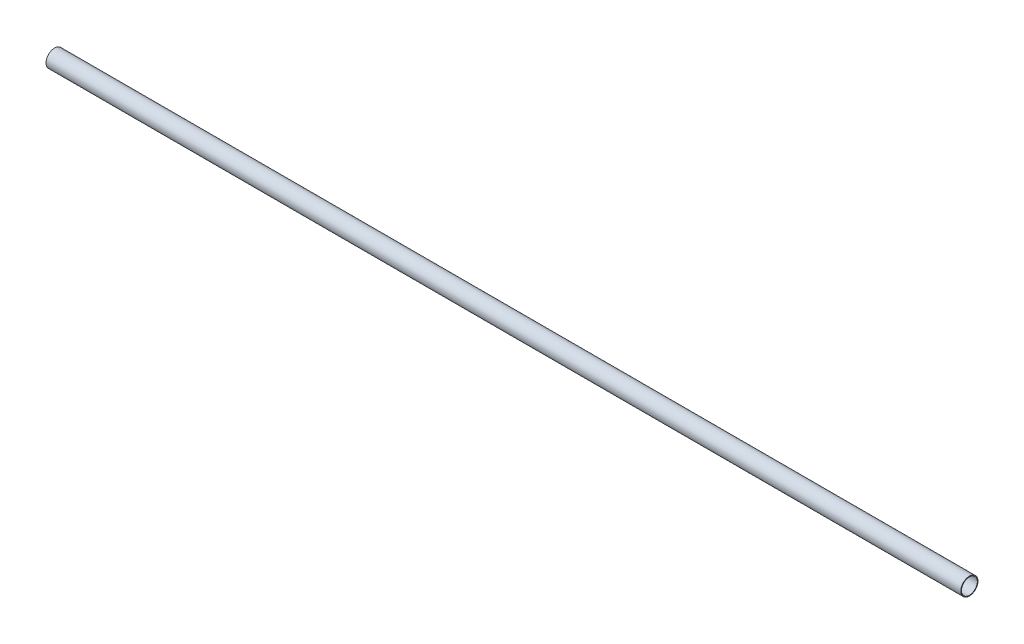
ISO-10303-21;
HEADER;
FILE_DESCRIPTION(('STEP AP214'),'2;1');
FILE_NAME('part.step','',(''),(''),'','','');
FILE_SCHEMA(('AUTOMOTIVE_DESIGN { 1 0 10303 214 1 1 1 1 }'));
ENDSEC;
DATA;
#1=APPLICATION_CONTEXT('core data for automotive mechanical design processes');
#2=APPLICATION_PROTOCOL_DEFINITION('international standard','automotive_design',2000,#1);
#3=PRODUCT_CONTEXT('',#1,'mechanical');
#4=PRODUCT('Part','Part','',(#3));
#5=PRODUCT_RELATED_PRODUCT_CATEGORY('part','',(#4));
#6=PRODUCT_DEFINITION_FORMATION('','',#4);
#7=PRODUCT_DEFINITION_CONTEXT('part definition',#1,'design');
#8=PRODUCT_DEFINITION('design','',#6,#7);
#9=PRODUCT_DEFINITION_SHAPE('','',#8);
#10=(LENGTH_UNIT() NAMED_UNIT(*) SI_UNIT(.MILLI.,.METRE.));
#11=(NAMED_UNIT(*) PLANE_ANGLE_UNIT() SI_UNIT($,.RADIAN.));
#12=(NAMED_UNIT(*) SI_UNIT($,.STERADIAN.) SOLID_ANGLE_UNIT());
#13=UNCERTAINTY_MEASURE_WITH_UNIT(LENGTH_MEASURE(1.E-05),#10,'distance_accuracy_value','');
#14=(GEOMETRIC_REPRESENTATION_CONTEXT(3) GLOBAL_UNCERTAINTY_ASSIGNED_CONTEXT((#13)) GLOBAL_UNIT_ASSIGNED_CONTEXT((#10,
#11,#12)) REPRESENTATION_CONTEXT('',''));
#15=CARTESIAN_POINT('',(0.,0.,0.));
#16=DIRECTION('',(0.,0.,1.));
#17=DIRECTION('',(1.,0.,0.));
#18=AXIS2_PLACEMENT_3D('',#15,#16,#17);
#19=CARTESIAN_POINT('',(1350.,0.,0.));
#20=DIRECTION('',(1.,0.,0.));
#21=DIRECTION('',(0.,0.,-1.));
#22=AXIS2_PLACEMENT_3D('',#19,#20,#21);
#23=PLANE('',#22);
#24=CARTESIAN_POINT('',(1350.,0.,0.));
#25=DIRECTION('',(1.,0.,0.));
#26=DIRECTION('',(0.,0.,-1.));
#27=AXIS2_PLACEMENT_3D('',#24,#25,#26);
#28=CIRCLE('',#27,25.4);
#29=CARTESIAN_POINT('',(1350.,0.,-25.4));
#30=VERTEX_POINT('',#29);
#31=EDGE_CURVE('E111',#30,#30,#28,.T.);
#32=ORIENTED_EDGE('',*,*,#31,.T.);
#33=EDGE_LOOP('',(#32));
#34=FACE_BOUND('',#33,.T.);
#35=CARTESIAN_POINT('',(1350.,0.,0.));
#36=DIRECTION('',(1.,0.,0.));
#37=DIRECTION('',(0.,0.,-1.));
#38=AXIS2_PLACEMENT_3D('',#35,#36,#37);
#39=CIRCLE('',#38,23.4);
#40=CARTESIAN_POINT('',(1350.,0.,-23.4));
#41=VERTEX_POINT('',#40);
#42=EDGE_CURVE('E105',#41,#41,#39,.T.);
#43=ORIENTED_EDGE('',*,*,#42,.F.);
#44=EDGE_LOOP('',(#43));
#45=FACE_BOUND('',#44,.T.);
#46=ADVANCED_FACE('F32',(#34,#45),#23,.T.);
#47=CARTESIAN_POINT('',(-1350.,0.,0.));
#48=DIRECTION('',(1.,0.,0.));
#49=DIRECTION('',(0.,0.,-1.));
#50=AXIS2_PLACEMENT_3D('',#47,#48,#49);
#51=PLANE('',#50);
#52=CARTESIAN_POINT('',(-1350.,0.,0.));
#53=DIRECTION('',(1.,0.,0.));
#54=DIRECTION('',(0.,0.,-1.));
#55=AXIS2_PLACEMENT_3D('',#52,#53,#54);
#56=CIRCLE('',#55,25.4);
#57=CARTESIAN_POINT('',(-1350.,0.,-25.4));
#58=VERTEX_POINT('',#57);
#59=EDGE_CURVE('E108',#58,#58,#56,.T.);
#60=ORIENTED_EDGE('',*,*,#59,.F.);
#61=EDGE_LOOP('',(#60));
#62=FACE_BOUND('',#61,.T.);
#63=CARTESIAN_POINT('',(-1350.,0.,0.));
#64=DIRECTION('',(1.,0.,0.));
#65=DIRECTION('',(0.,0.,-1.));
#66=AXIS2_PLACEMENT_3D('',#63,#64,#65);
#67=CIRCLE('',#66,23.4);
#68=CARTESIAN_POINT('',(-1350.,0.,-23.4));
#69=VERTEX_POINT('',#68);
#70=EDGE_CURVE('E86',#69,#69,#67,.T.);
#71=ORIENTED_EDGE('',*,*,#70,.T.);
#72=EDGE_LOOP('',(#71));
#73=FACE_BOUND('',#72,.T.);
#74=ADVANCED_FACE('F152',(#62,#73),#51,.F.);
#75=CARTESIAN_POINT('',(1350.,0.,0.));
#76=DIRECTION('',(-1.,0.,0.));
#77=DIRECTION('',(0.,0.,1.));
#78=AXIS2_PLACEMENT_3D('',#75,#76,#77);
#79=CYLINDRICAL_SURFACE('',#78,25.4);
#80=CARTESIAN_POINT('',(-1335.46577712364,0.,-25.4));
#81=CARTESIAN_POINT('',(-1335.46578622155,0.22320132829687,-25.3999963048456));
#82=CARTESIAN_POINT('',(-1335.48452227427,0.446528817383909,-25.3970271916482));
#83=CARTESIAN_POINT('',(-1335.55894716432,0.886932163470755,-25.3854686317683));
#84=CARTESIAN_POINT('',(-1335.61467111013,1.10400187620866,-25.376873845372));
#85=CARTESIAN_POINT('',(-1335.76135760594,1.52545320040674,-25.3550289969891));
#86=CARTESIAN_POINT('',(-1335.85229256232,1.72984460225414,-25.3417825810753));
#87=CARTESIAN_POINT('',(-1336.06675019398,2.12043884011586,-25.3120950335819));
#88=CARTESIAN_POINT('',(-1336.19026869338,2.3066440026761,-25.295654311453));
#89=CARTESIAN_POINT('',(-1336.46751502863,2.6572059411343,-25.2612462689999));
#90=CARTESIAN_POINT('',(-1336.62146736231,2.82138413445844,-25.2432682042159));
#91=CARTESIAN_POINT('',(-1336.95472804527,3.12169012879659,-25.2078949969187));
#92=CARTESIAN_POINT('',(-1337.1340379124,3.25781624947959,-25.1904998893771));
#93=CARTESIAN_POINT('',(-1337.51413547559,3.49885821732156,-25.1581579992775));
#94=CARTESIAN_POINT('',(-1337.71503509387,3.60359960030141,-25.1432251029844));
#95=CARTESIAN_POINT('',(-1338.13185033653,3.77778362313468,-25.1176461765073));
#96=CARTESIAN_POINT('',(-1338.34776505674,3.847228386359,-25.1069998884578));
#97=CARTESIAN_POINT('',(-1338.78659663129,3.94828970932429,-25.0913058334978));
#98=CARTESIAN_POINT('',(-1339.00944115593,3.98021316108151,-25.0862126720068));
#99=CARTESIAN_POINT('',(-1339.45737769604,4.0062767445737,-25.0820639489634));
#100=CARTESIAN_POINT('',(-1339.68246956852,4.00041926496776,-25.0830080057142));
#101=CARTESIAN_POINT('',(-1340.12633342745,3.95133769468823,-25.0907855692924));
#102=CARTESIAN_POINT('',(-1340.3451444359,3.90845668628441,-25.0975650002669));
#103=CARTESIAN_POINT('',(-1340.77242669155,3.78708294390799,-25.1161648938635));
#104=CARTESIAN_POINT('',(-1340.9808976188,3.70858910870606,-25.1279855123701));
#105=CARTESIAN_POINT('',(-1341.38261851354,3.51786497065764,-25.1553950542063));
#106=CARTESIAN_POINT('',(-1341.575798941,3.4054905952611,-25.1710000133761));
#107=CARTESIAN_POINT('',(-1341.94069143724,3.15029773841544,-25.204208565353));
#108=CARTESIAN_POINT('',(-1342.11240195404,3.00747705815027,-25.2218123024679));
#109=CARTESIAN_POINT('',(-1342.4314677136,2.69356859729772,-25.2572732692388));
#110=CARTESIAN_POINT('',(-1342.57853309469,2.52218610955714,-25.2751311516354));
#111=CARTESIAN_POINT('',(-1342.84186003575,2.15702001416614,-25.3089081302338));
#112=CARTESIAN_POINT('',(-1342.95812143469,1.96323628941501,-25.3248272162998));
#113=CARTESIAN_POINT('',(-1343.1565600706,1.55850799610384,-25.3529521069687));
#114=CARTESIAN_POINT('',(-1343.23871353002,1.3475515781293,-25.3651553195624));
#115=CARTESIAN_POINT('',(-1343.36634485434,0.914600993953395,-25.3844522233017));
#116=CARTESIAN_POINT('',(-1343.41182545486,0.692607652363941,-25.3915462955598));
#117=CARTESIAN_POINT('',(-1343.46443132465,0.246385030525779,-25.3997747978797));
#118=CARTESIAN_POINT('',(-1343.47195483973,0.0222038000204775,-25.4009711042602));
#119=CARTESIAN_POINT('',(-1343.44949207929,-0.424217598490147,-25.3974381710905));
#120=CARTESIAN_POINT('',(-1343.41950708751,-0.646457832663801,-25.3927091343346));
#121=CARTESIAN_POINT('',(-1343.32320968329,-1.08147196818116,-25.3778951520576));
#122=CARTESIAN_POINT('',(-1343.25709266548,-1.29429018904899,-25.3678390232502));
#123=CARTESIAN_POINT('',(-1343.0906150597,-1.70582107435153,-25.3434943492887));
#124=CARTESIAN_POINT('',(-1342.99025272351,-1.90453301804432,-25.3292055880664));
#125=CARTESIAN_POINT('',(-1342.75720878978,-2.28395253972232,-25.2978286107273));
#126=CARTESIAN_POINT('',(-1342.62427624932,-2.46450418419877,-25.2807190129001));
#127=CARTESIAN_POINT('',(-1342.33021291834,-2.80087851277391,-25.2456676091585));
#128=CARTESIAN_POINT('',(-1342.16908031162,-2.9566996028881,-25.2277257496978));
#129=CARTESIAN_POINT('',(-1341.82141203782,-3.24065058894714,-25.1928340779654));
#130=CARTESIAN_POINT('',(-1341.63465633801,-3.36851258781255,-25.1758949089374));
#131=CARTESIAN_POINT('',(-1341.24208361991,-3.59104987751306,-25.145119492013));
#132=CARTESIAN_POINT('',(-1341.03626715716,-3.68572613518738,-25.1312831537224));
#133=CARTESIAN_POINT('',(-1340.61219238071,-3.83879553844053,-25.1083582995216));
#134=CARTESIAN_POINT('',(-1340.39398476485,-3.89732632664429,-25.0992517936559));
#135=CARTESIAN_POINT('',(-1339.95068139388,-3.97687933024703,-25.0867710154198));
#136=CARTESIAN_POINT('',(-1339.72558616904,-3.99790442580794,-25.0833963028907));
#137=CARTESIAN_POINT('',(-1339.27756948476,-4.0017755295102,-25.0827787630464));
#138=CARTESIAN_POINT('',(-1339.05465164642,-3.98504294753408,-25.0854682534716));
#139=CARTESIAN_POINT('',(-1338.61484367466,-3.91478029522453,-25.0965284468486));
#140=CARTESIAN_POINT('',(-1338.39795352747,-3.86125030890797,-25.1048991368289));
#141=CARTESIAN_POINT('',(-1337.97649463766,-3.71906686894459,-25.1263539986715));
#142=CARTESIAN_POINT('',(-1337.77191471338,-3.63044586145514,-25.1394338153301));
#143=CARTESIAN_POINT('',(-1337.38045843797,-3.42063846967856,-25.1688379679289));
#144=CARTESIAN_POINT('',(-1337.19358280936,-3.29945075711808,-25.1851624361991));
#145=CARTESIAN_POINT('',(-1336.84070390847,-3.02643070576745,-25.2194328374939));
#146=CARTESIAN_POINT('',(-1336.67494289661,-2.87428713240574,-25.2373941246537));
#147=CARTESIAN_POINT('',(-1336.37115725493,-2.5443317033794,-25.2727887089707));
#148=CARTESIAN_POINT('',(-1336.23313905835,-2.36651391053583,-25.2902218828701));
#149=CARTESIAN_POINT('',(-1335.98799598179,-1.98897413334483,-25.3227184076354));
#150=CARTESIAN_POINT('',(-1335.88106484242,-1.78912505569151,-25.3377666415464));
#151=CARTESIAN_POINT('',(-1335.70245112027,-1.37415386484051,-25.3636501714065));
#152=CARTESIAN_POINT('',(-1335.63073263936,-1.15904756306151,-25.3744897555636));
#153=CARTESIAN_POINT('',(-1335.54054462394,-0.785859429064369,-25.3883076356595));
#154=CARTESIAN_POINT('',(-1335.51255054884,-0.630061832277178,-25.3926693557502));
#155=CARTESIAN_POINT('',(-1335.47516370994,-0.316197242810094,-25.398516826142));
#156=CARTESIAN_POINT('',(-1335.46577067808,-0.158130282866009,-25.4000026178868));
#157=CARTESIAN_POINT('',(-1335.46577712364,0.,-25.4));
#158=B_SPLINE_CURVE_WITH_KNOTS('',3,(#80,#81,#82,#83,#84,#85,#86,#87,#88,#89,#90,#91,#92,#93,
#94,#95,#96,#97,#98,#99,#100,#101,#102,#103,#104,#105,#106,#107,#108,#109,#110,#111,#112,#113,
#114,#115,#116,#117,#118,#119,#120,#121,#122,#123,#124,#125,#126,#127,#128,#129,#130,#131,#132,
#133,#134,#135,#136,#137,#138,#139,#140,#141,#142,#143,#144,#145,#146,#147,#148,#149,#150,#151,
#152,#153,#154,#155,#156,#157),.UNSPECIFIED.,.T.,.F.,(4,2,2,2,2,2,2,2,2,2,2,2,2,2,2,2,2,2,2,2,2,
2,2,2,2,2,2,2,2,2,2,2,2,2,2,2,2,2,4),(0.,0.669026079209023,1.33868809980632,2.00782638855552,
2.67687896273317,3.35106455681452,4.02529052316656,4.7031977209859,5.38106413249618,
6.05334672177282,6.72558680711622,7.39166356492719,8.05776092074523,8.72673170461458,
9.39575081757729,10.0721571157612,10.7485669499654,11.4254475389495,12.102277631303,
12.7719914331612,13.4416823147384,14.1077869753407,14.7739256452369,15.4453676616824,
16.1168529377283,16.794514766337,17.4721568501855,18.1472022860515,18.8221958811504,
19.4896932436495,20.1571890821049,20.8240691707268,21.4909764630074,22.1649534045539,
22.8390864540498,23.517334937826,24.1948905268534,24.6688787800976,25.1428602028665),.UNSPECIFIED.);
#159=CARTESIAN_POINT('',(-1335.46577712364,0.,-25.4));
#160=VERTEX_POINT('',#159);
#161=EDGE_CURVE('E95',#160,#160,#158,.T.);
#162=ORIENTED_EDGE('',*,*,#161,.T.);
#163=EDGE_LOOP('',(#162));
#164=FACE_BOUND('',#163,.T.);
#165=DIRECTION('',(-1.,0.,0.));
#166=VECTOR('',#165,1.);
#167=CARTESIAN_POINT('',(1350.,5.00000000000012,-24.9030118660374));
#168=LINE('',#167,#166);
#169=CARTESIAN_POINT('',(1260.,5.00000000000011,-24.9030118660374));
#170=VERTEX_POINT('',#169);
#171=CARTESIAN_POINT('',(-1260.,4.9999999999998,-24.9030118660374));
#172=VERTEX_POINT('',#171);
#173=EDGE_CURVE('E82',#170,#172,#168,.T.);
#174=ORIENTED_EDGE('',*,*,#173,.T.);
#175=CARTESIAN_POINT('',(-1260.,0.,0.));
#176=DIRECTION('',(-1.,0.,0.));
#177=DIRECTION('',(0.,0.,1.));
#178=AXIS2_PLACEMENT_3D('',#175,#176,#177);
#179=CIRCLE('',#178,25.4);
#180=CARTESIAN_POINT('',(-1260.,-5.0000000000002,-24.9030118660374));
#181=VERTEX_POINT('',#180);
#182=EDGE_CURVE('E78',#172,#181,#179,.T.);
#183=ORIENTED_EDGE('',*,*,#182,.T.);
#184=DIRECTION('',(-1.,0.,0.));
#185=VECTOR('',#184,1.);
#186=CARTESIAN_POINT('',(1350.,-4.99999999999988,-24.9030118660374));
#187=LINE('',#186,#185);
#188=CARTESIAN_POINT('',(1260.,-4.99999999999989,-24.9030118660374));
#189=VERTEX_POINT('',#188);
#190=EDGE_CURVE('E80',#181,#189,#187,.F.);
#191=ORIENTED_EDGE('',*,*,#190,.T.);
#192=CARTESIAN_POINT('',(1260.,0.,0.));
#193=DIRECTION('',(1.,0.,0.));
#194=DIRECTION('',(0.,0.,-1.));
#195=AXIS2_PLACEMENT_3D('',#192,#193,#194);
#196=CIRCLE('',#195,25.4);
#197=EDGE_CURVE('E89',#189,#170,#196,.T.);
#198=ORIENTED_EDGE('',*,*,#197,.T.);
#199=EDGE_LOOP('',(#174,#183,#191,#198));
#200=FACE_BOUND('',#199,.T.);
#201=ORIENTED_EDGE('',*,*,#31,.F.);
#202=EDGE_LOOP('',(#201));
#203=FACE_BOUND('',#202,.T.);
#204=ORIENTED_EDGE('',*,*,#59,.T.);
#205=EDGE_LOOP('',(#204));
#206=FACE_BOUND('',#205,.T.);
#207=ADVANCED_FACE('F34',(#164,#200,#203,#206),#79,.T.);
#208=CARTESIAN_POINT('',(1350.,0.,0.));
#209=DIRECTION('',(-1.,0.,0.));
#210=DIRECTION('',(0.,0.,1.));
#211=AXIS2_PLACEMENT_3D('',#208,#209,#210);
#212=CYLINDRICAL_SURFACE('',#211,23.4);
#213=CARTESIAN_POINT('',(-1335.46577712364,0.,-23.4));
#214=CARTESIAN_POINT('',(-1335.46578598634,0.222940372110689,-23.3999961265631));
#215=CARTESIAN_POINT('',(-1335.48447849491,0.446000302550702,-23.3967808179266));
#216=CARTESIAN_POINT('',(-1335.55872022176,0.885858229001332,-23.3842639873838));
#217=CARTESIAN_POINT('',(-1335.6143027867,1.10265037406509,-23.3749569589891));
#218=CARTESIAN_POINT('',(-1335.7605925434,1.52354574677073,-23.351300048625));
#219=CARTESIAN_POINT('',(-1335.85127041278,1.72765940259511,-23.3369543773985));
#220=CARTESIAN_POINT('',(-1336.06509868528,2.11775050016078,-23.3047954039874));
#221=CARTESIAN_POINT('',(-1336.18824558918,2.30372989329347,-23.2869824755267));
#222=CARTESIAN_POINT('',(-1336.46483025906,2.65416410727059,-23.2496621222938));
#223=CARTESIAN_POINT('',(-1336.61853019847,2.81841055845502,-23.2301409128786));
#224=CARTESIAN_POINT('',(-1336.95129370134,3.11891608589203,-23.1917090326056));
#225=CARTESIAN_POINT('',(-1337.13035890599,3.25517334977036,-23.1727984013513));
#226=CARTESIAN_POINT('',(-1337.51020945569,3.49667396504465,-23.1375952395481));
#227=CARTESIAN_POINT('',(-1337.71112833871,3.60171010003428,-23.1213205141938));
#228=CARTESIAN_POINT('',(-1338.12808309019,3.77646148207153,-23.0934237150091));
#229=CARTESIAN_POINT('',(-1338.34411788165,3.84617924261551,-23.0818013101001));
#230=CARTESIAN_POINT('',(-1338.78295901979,3.94765590481854,-23.0646626218229));
#231=CARTESIAN_POINT('',(-1339.00567970476,3.97977528117881,-23.059088390019));
#232=CARTESIAN_POINT('',(-1339.45341359249,4.00626132353227,-23.0545020090251));
#233=CARTESIAN_POINT('',(-1339.67842662334,4.00063080001318,-23.0554893713229));
#234=CARTESIAN_POINT('',(-1340.12177719994,3.95207023068563,-23.0638617396133));
#235=CARTESIAN_POINT('',(-1340.34016071154,3.9095460900212,-23.0711771218823));
#236=CARTESIAN_POINT('',(-1340.76664722086,3.78904283300528,-23.0912722138768));
#237=CARTESIAN_POINT('',(-1340.97474984901,3.71106244318086,-23.1040521198692));
#238=CARTESIAN_POINT('',(-1341.37597707579,3.52145160666646,-23.1337110210633));
#239=CARTESIAN_POINT('',(-1341.56902088747,3.40965352231409,-23.1506103537268));
#240=CARTESIAN_POINT('',(-1341.93376254385,3.15569976204398,-23.1865899962551));
#241=CARTESIAN_POINT('',(-1342.10545857641,3.01354151174386,-23.2056704910071));
#242=CARTESIAN_POINT('',(-1342.42497958831,2.70069572069545,-23.2441679965478));
#243=CARTESIAN_POINT('',(-1342.57246385916,2.52966012551652,-23.2635861496938));
#244=CARTESIAN_POINT('',(-1342.83669232938,2.16508939820843,-23.3003411645487));
#245=CARTESIAN_POINT('',(-1342.95343631112,1.9715541068053,-23.3176780115225));
#246=CARTESIAN_POINT('',(-1343.15290500451,1.56715053683592,-23.3483435607896));
#247=CARTESIAN_POINT('',(-1343.2355985743,1.35626660204703,-23.3616685909726));
#248=CARTESIAN_POINT('',(-1343.36429737591,0.923324486033739,-23.382779897454));
#249=CARTESIAN_POINT('',(-1343.41030583838,0.701267290607831,-23.3905666614702));
#250=CARTESIAN_POINT('',(-1343.46386412471,0.25521757300059,-23.3996582201952));
#251=CARTESIAN_POINT('',(-1343.47188149204,0.0312827406514265,-23.4010418115882));
#252=CARTESIAN_POINT('',(-1343.45047799131,-0.414729841766611,-23.3973873107757));
#253=CARTESIAN_POINT('',(-1343.42105864128,-0.636807666767839,-23.3923494789529));
#254=CARTESIAN_POINT('',(-1343.32600567477,-1.07135049441291,-23.376467025083));
#255=CARTESIAN_POINT('',(-1343.2606045323,-1.28386782982784,-23.3656596922424));
#256=CARTESIAN_POINT('',(-1343.09569303719,-1.69492162228745,-23.3394450974249));
#257=CARTESIAN_POINT('',(-1342.99618068738,-1.89345725989892,-23.3240375661184));
#258=CARTESIAN_POINT('',(-1342.76480782417,-2.27293588462409,-23.2901359447006));
#259=CARTESIAN_POINT('',(-1342.63265650125,-2.45369908034729,-23.2716146127203));
#260=CARTESIAN_POINT('',(-1342.34015572962,-2.79065044811609,-23.2336194803354));
#261=CARTESIAN_POINT('',(-1342.17980411941,-2.94683673464546,-23.2141456070028));
#262=CARTESIAN_POINT('',(-1341.83335363922,-3.23194239691053,-23.1761841188708));
#263=CARTESIAN_POINT('',(-1341.64699261548,-3.36054523466335,-23.1577096035047));
#264=CARTESIAN_POINT('',(-1341.25503791413,-3.58461985277518,-23.1240868391052));
#265=CARTESIAN_POINT('',(-1341.04944486898,-3.68009272213401,-23.1089384807452));
#266=CARTESIAN_POINT('',(-1340.62573122262,-3.8347286439771,-23.083782369853));
#267=CARTESIAN_POINT('',(-1340.40766858866,-3.89404680129622,-23.0737526886301));
#268=CARTESIAN_POINT('',(-1339.96448811462,-3.97517581377871,-23.0599154460745));
#269=CARTESIAN_POINT('',(-1339.73937092497,-3.99699011647669,-23.0561073128288));
#270=CARTESIAN_POINT('',(-1339.29163425403,-4.00239224250222,-23.0551698550697));
#271=CARTESIAN_POINT('',(-1339.06902081269,-3.986478498361,-23.0579534454608));
#272=CARTESIAN_POINT('',(-1338.62968933473,-3.91795667598788,-23.0696944967354));
#273=CARTESIAN_POINT('',(-1338.41297127608,-3.86534873484488,-23.0786519345535));
#274=CARTESIAN_POINT('',(-1337.99178995687,-3.7251266868852,-23.1016975984051));
#275=CARTESIAN_POINT('',(-1337.78731129868,-3.63755767410798,-23.1157792130288));
#276=CARTESIAN_POINT('',(-1337.39586720842,-3.42995103203085,-23.1474926205498));
#277=CARTESIAN_POINT('',(-1337.20890271934,-3.30991165584959,-23.1651246044415));
#278=CARTESIAN_POINT('',(-1336.8552800939,-3.03900186894387,-23.2022270412092));
#279=CARTESIAN_POINT('',(-1336.68890438562,-2.88776551129381,-23.2217176855487));
#280=CARTESIAN_POINT('',(-1336.38372285541,-2.55952503872298,-23.2601822932373));
#281=CARTESIAN_POINT('',(-1336.24492339608,-2.38251499340386,-23.2791561364771));
#282=CARTESIAN_POINT('',(-1335.99790336449,-2.0062123227739,-23.3146103346149));
#283=CARTESIAN_POINT('',(-1335.88991353087,-1.8067663973359,-23.3310714660638));
#284=CARTESIAN_POINT('',(-1335.70913876925,-1.3923608817256,-23.3594584624716));
#285=CARTESIAN_POINT('',(-1335.63631916647,-1.1774168127121,-23.371388791914));
#286=CARTESIAN_POINT('',(-1335.54355939042,-0.801396199646937,-23.3867997268503));
#287=CARTESIAN_POINT('',(-1335.51443835765,-0.642580379476468,-23.3917230810422));
#288=CARTESIAN_POINT('',(-1335.47554419888,-0.322530536874817,-23.3983245885204));
#289=CARTESIAN_POINT('',(-1335.4657707115,-0.161296559665428,-23.4000028024177));
#290=CARTESIAN_POINT('',(-1335.46577712364,0.,-23.4));
#291=B_SPLINE_CURVE_WITH_KNOTS('',3,(#213,#214,#215,#216,#217,#218,#219,#220,#221,#222,#223,
#224,#225,#226,#227,#228,#229,#230,#231,#232,#233,#234,#235,#236,#237,#238,#239,#240,#241,#242,
#243,#244,#245,#246,#247,#248,#249,#250,#251,#252,#253,#254,#255,#256,#257,#258,#259,#260,#261,
#262,#263,#264,#265,#266,#267,#268,#269,#270,#271,#272,#273,#274,#275,#276,#277,#278,#279,#280,
#281,#282,#283,#284,#285,#286,#287,#288,#289,#290),.UNSPECIFIED.,.T.,.F.,(4,2,2,2,2,2,2,2,2,2,2,
2,2,2,2,2,2,2,2,2,2,2,2,2,2,2,2,2,2,2,2,2,2,2,2,2,2,2,4),(0.,0.668231475792542,1.33706782182497,
2.0053465527747,2.67355329205341,3.34776271929399,4.02201578963388,4.70064881295013,
5.37923353332572,6.05125760416755,6.72323164323632,7.38790502265663,8.05260227686507,
8.72065005429519,9.3887545011699,10.0655765561423,10.7424034025883,11.4198478941979,
12.0972327204351,12.7662591653276,13.4352584826946,14.0999853885291,14.7647512200216,
15.4356683913679,16.1066370097491,16.7849360755555,17.4632128431953,18.1385589165734,
18.8138429055737,19.480255401847,20.1466654084279,20.8122186183001,21.4778076415629,
22.1517001502576,22.8257479640478,23.5047187276887,24.1830187121726,24.6664908184866,
25.1499538946672),.UNSPECIFIED.);
#292=CARTESIAN_POINT('',(-1335.46577712364,0.,-23.4));
#293=VERTEX_POINT('',#292);
#294=EDGE_CURVE('E37',#293,#293,#291,.T.);
#295=ORIENTED_EDGE('',*,*,#294,.F.);
#296=EDGE_LOOP('',(#295));
#297=FACE_BOUND('',#296,.T.);
#298=CARTESIAN_POINT('',(-1260.,0.,0.));
#299=DIRECTION('',(-1.,0.,0.));
#300=DIRECTION('',(0.,0.,1.));
#301=AXIS2_PLACEMENT_3D('',#298,#299,#300);
#302=CIRCLE('',#301,23.4);
#303=CARTESIAN_POINT('',(-1260.,4.9999999999998,-22.8595712995672));
#304=VERTEX_POINT('',#303);
#305=CARTESIAN_POINT('',(-1260.,-4.99999999999988,-22.8595712995673));
#306=VERTEX_POINT('',#305);
#307=EDGE_CURVE('E11',#304,#306,#302,.T.);
#308=ORIENTED_EDGE('',*,*,#307,.F.);
#309=DIRECTION('',(-1.,0.,0.));
#310=VECTOR('',#309,1.);
#311=CARTESIAN_POINT('',(1350.,5.00000000000012,-22.8595712995672));
#312=LINE('',#311,#310);
#313=CARTESIAN_POINT('',(1260.,5.00000000000011,-22.8595712995672));
#314=VERTEX_POINT('',#313);
#315=EDGE_CURVE('E46',#314,#304,#312,.T.);
#316=ORIENTED_EDGE('',*,*,#315,.F.);
#317=CARTESIAN_POINT('',(1260.,0.,0.));
#318=DIRECTION('',(1.,0.,0.));
#319=DIRECTION('',(0.,0.,-1.));
#320=AXIS2_PLACEMENT_3D('',#317,#318,#319);
#321=CIRCLE('',#320,23.4);
#322=CARTESIAN_POINT('',(1260.,-4.99999999999989,-22.8595712995673));
#323=VERTEX_POINT('',#322);
#324=EDGE_CURVE('E118',#323,#314,#321,.T.);
#325=ORIENTED_EDGE('',*,*,#324,.F.);
#326=DIRECTION('',(-1.,0.,0.));
#327=VECTOR('',#326,1.);
#328=CARTESIAN_POINT('',(1350.,-4.99999999999988,-22.8595712995673));
#329=LINE('',#328,#327);
#330=EDGE_CURVE('E114',#306,#323,#329,.F.);
#331=ORIENTED_EDGE('',*,*,#330,.F.);
#332=EDGE_LOOP('',(#308,#316,#325,#331));
#333=FACE_BOUND('',#332,.T.);
#334=ORIENTED_EDGE('',*,*,#42,.T.);
#335=EDGE_LOOP('',(#334));
#336=FACE_BOUND('',#335,.T.);
#337=ORIENTED_EDGE('',*,*,#70,.F.);
#338=EDGE_LOOP('',(#337));
#339=FACE_BOUND('',#338,.T.);
#340=ADVANCED_FACE('F128',(#297,#333,#336,#339),#212,.F.);
#341=CARTESIAN_POINT('',(-1260.,-5.0000000000002,-25.4));
#342=DIRECTION('',(-1.,0.,0.));
#343=DIRECTION('',(0.,0.,1.));
#344=AXIS2_PLACEMENT_3D('',#341,#342,#343);
#345=PLANE('',#344);
#346=DIRECTION('',(0.,0.,1.));
#347=VECTOR('',#346,1.);
#348=CARTESIAN_POINT('',(-1260.,4.9999999999998,-25.4));
#349=LINE('',#348,#347);
#350=EDGE_CURVE('E90',#172,#304,#349,.T.);
#351=ORIENTED_EDGE('',*,*,#350,.T.);
#352=ORIENTED_EDGE('',*,*,#307,.T.);
#353=DIRECTION('',(0.,0.,1.));
#354=VECTOR('',#353,1.);
#355=CARTESIAN_POINT('',(-1260.,-5.0000000000002,-25.4));
#356=LINE('',#355,#354);
#357=EDGE_CURVE('E58',#181,#306,#356,.T.);
#358=ORIENTED_EDGE('',*,*,#357,.F.);
#359=ORIENTED_EDGE('',*,*,#182,.F.);
#360=EDGE_LOOP('',(#351,#352,#358,#359));
#361=FACE_BOUND('',#360,.T.);
#362=ADVANCED_FACE('F92',(#361),#345,.F.);
#363=CARTESIAN_POINT('',(1260.,5.00000000000011,-25.4));
#364=DIRECTION('',(0.,1.,0.));
#365=DIRECTION('',(-1.,0.,0.));
#366=AXIS2_PLACEMENT_3D('',#363,#364,#365);
#367=PLANE('',#366);
#368=DIRECTION('',(0.,0.,1.));
#369=VECTOR('',#368,1.);
#370=CARTESIAN_POINT('',(1260.,5.00000000000011,-25.4));
#371=LINE('',#370,#369);
#372=EDGE_CURVE('E97',#170,#314,#371,.T.);
#373=ORIENTED_EDGE('',*,*,#372,.T.);
#374=ORIENTED_EDGE('',*,*,#315,.T.);
#375=ORIENTED_EDGE('',*,*,#350,.F.);
#376=ORIENTED_EDGE('',*,*,#173,.F.);
#377=EDGE_LOOP('',(#373,#374,#375,#376));
#378=FACE_BOUND('',#377,.T.);
#379=ADVANCED_FACE('F123',(#378),#367,.F.);
#380=CARTESIAN_POINT('',(1260.,-4.99999999999989,-25.4));
#381=DIRECTION('',(1.,0.,0.));
#382=DIRECTION('',(0.,0.,-1.));
#383=AXIS2_PLACEMENT_3D('',#380,#381,#382);
#384=PLANE('',#383);
#385=ORIENTED_EDGE('',*,*,#197,.F.);
#386=DIRECTION('',(0.,0.,1.));
#387=VECTOR('',#386,1.);
#388=CARTESIAN_POINT('',(1260.,-4.99999999999989,-25.4));
#389=LINE('',#388,#387);
#390=EDGE_CURVE('E53',#189,#323,#389,.T.);
#391=ORIENTED_EDGE('',*,*,#390,.T.);
#392=ORIENTED_EDGE('',*,*,#324,.T.);
#393=ORIENTED_EDGE('',*,*,#372,.F.);
#394=EDGE_LOOP('',(#385,#391,#392,#393));
#395=FACE_BOUND('',#394,.T.);
#396=ADVANCED_FACE('F131',(#395),#384,.F.);
#397=CARTESIAN_POINT('',(1260.,-4.99999999999989,-25.4));
#398=DIRECTION('',(0.,-1.,0.));
#399=DIRECTION('',(1.,0.,0.));
#400=AXIS2_PLACEMENT_3D('',#397,#398,#399);
#401=PLANE('',#400);
#402=ORIENTED_EDGE('',*,*,#357,.T.);
#403=ORIENTED_EDGE('',*,*,#330,.T.);
#404=ORIENTED_EDGE('',*,*,#390,.F.);
#405=ORIENTED_EDGE('',*,*,#190,.F.);
#406=EDGE_LOOP('',(#402,#403,#404,#405));
#407=FACE_BOUND('',#406,.T.);
#408=ADVANCED_FACE('F88',(#407),#401,.F.);
#409=CARTESIAN_POINT('',(-1339.46577712364,0.,-25.4));
#410=DIRECTION('',(0.,0.,1.));
#411=DIRECTION('',(1.,0.,0.));
#412=AXIS2_PLACEMENT_3D('',#409,#410,#411);
#413=CYLINDRICAL_SURFACE('',#412,3.99999999999999);
#414=ORIENTED_EDGE('',*,*,#294,.T.);
#415=EDGE_LOOP('',(#414));
#416=FACE_BOUND('',#415,.T.);
#417=ORIENTED_EDGE('',*,*,#161,.F.);
#418=EDGE_LOOP('',(#417));
#419=FACE_BOUND('',#418,.T.);
#420=ADVANCED_FACE('F134',(#416,#419),#413,.F.);
#421=CLOSED_SHELL('',(#46,#74,#207,#340,#362,#379,#396,#408,#420));
#422=MANIFOLD_SOLID_BREP('B2',#421);
#423=ADVANCED_BREP_SHAPE_REPRESENTATION('',(#18,#422),#14);
#424=SHAPE_DEFINITION_REPRESENTATION(#9,#423);
ENDSEC;
END-ISO-10303-21;
